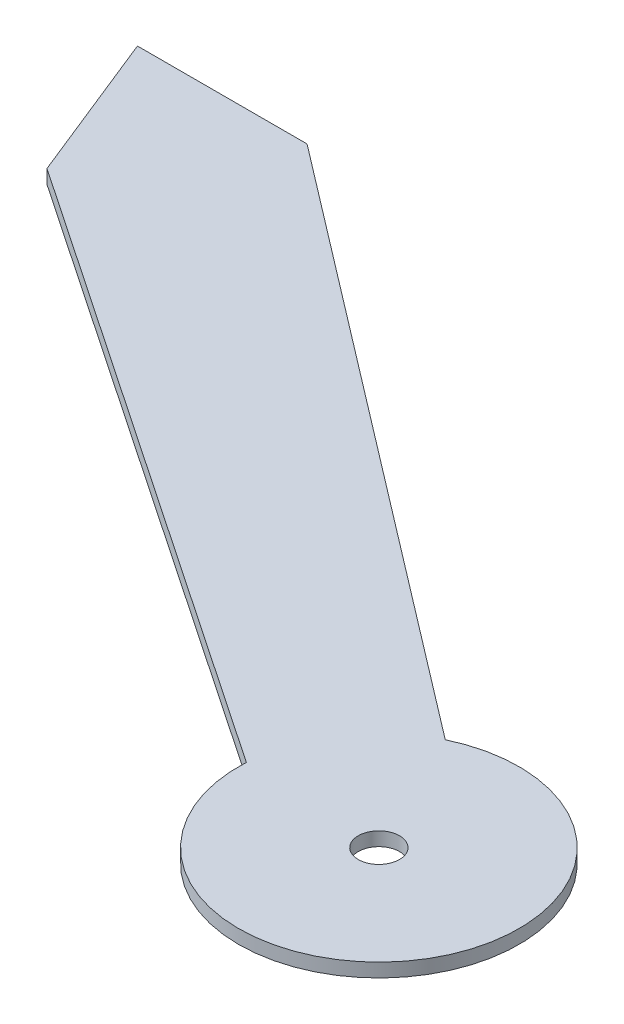
ISO-10303-21;
HEADER;
FILE_DESCRIPTION(('STEP AP214'),'2;1');
FILE_NAME('part.step','',(''),(''),'','','');
FILE_SCHEMA(('AUTOMOTIVE_DESIGN { 1 0 10303 214 1 1 1 1 }'));
ENDSEC;
DATA;
#1=APPLICATION_CONTEXT('core data for automotive mechanical design processes');
#2=APPLICATION_PROTOCOL_DEFINITION('international standard','automotive_design',2000,#1);
#3=PRODUCT_CONTEXT('',#1,'mechanical');
#4=PRODUCT('Part','Part','',(#3));
#5=PRODUCT_RELATED_PRODUCT_CATEGORY('part','',(#4));
#6=PRODUCT_DEFINITION_FORMATION('','',#4);
#7=PRODUCT_DEFINITION_CONTEXT('part definition',#1,'design');
#8=PRODUCT_DEFINITION('design','',#6,#7);
#9=PRODUCT_DEFINITION_SHAPE('','',#8);
#10=(LENGTH_UNIT() NAMED_UNIT(*) SI_UNIT(.MILLI.,.METRE.));
#11=(NAMED_UNIT(*) PLANE_ANGLE_UNIT() SI_UNIT($,.RADIAN.));
#12=(NAMED_UNIT(*) SI_UNIT($,.STERADIAN.) SOLID_ANGLE_UNIT());
#13=UNCERTAINTY_MEASURE_WITH_UNIT(LENGTH_MEASURE(1.E-05),#10,'distance_accuracy_value','');
#14=(GEOMETRIC_REPRESENTATION_CONTEXT(3) GLOBAL_UNCERTAINTY_ASSIGNED_CONTEXT((#13)) GLOBAL_UNIT_ASSIGNED_CONTEXT((#10,
#11,#12)) REPRESENTATION_CONTEXT('',''));
#15=CARTESIAN_POINT('',(0.,0.,0.));
#16=DIRECTION('',(0.,0.,1.));
#17=DIRECTION('',(1.,0.,0.));
#18=AXIS2_PLACEMENT_3D('',#15,#16,#17);
#19=CARTESIAN_POINT('',(0.,0.1,0.));
#20=DIRECTION('',(0.,1.,0.));
#21=DIRECTION('',(0.,0.,1.));
#22=AXIS2_PLACEMENT_3D('',#19,#20,#21);
#23=PLANE('',#22);
#24=CARTESIAN_POINT('',(0.,0.1,0.));
#25=DIRECTION('',(0.,1.,0.));
#26=DIRECTION('',(0.,0.,1.));
#27=AXIS2_PLACEMENT_3D('',#24,#25,#26);
#28=CIRCLE('',#27,0.15);
#29=CARTESIAN_POINT('',(0.,0.1,0.15));
#30=VERTEX_POINT('',#29);
#31=EDGE_CURVE('E173',#30,#30,#28,.T.);
#32=ORIENTED_EDGE('',*,*,#31,.F.);
#33=EDGE_LOOP('',(#32));
#34=FACE_BOUND('',#33,.T.);
#35=DIRECTION('',(-1.,0.,0.));
#36=VECTOR('',#35,1.);
#37=CARTESIAN_POINT('',(-5.9289769168446,0.1,-4.17249718028951));
#38=LINE('',#37,#36);
#39=CARTESIAN_POINT('',(-4.69495993819779,0.1,-4.17249718028951));
#40=VERTEX_POINT('',#39);
#41=CARTESIAN_POINT('',(-5.9289769168446,0.1,-4.17249718028951));
#42=VERTEX_POINT('',#41);
#43=EDGE_CURVE('E179',#40,#42,#38,.T.);
#44=ORIENTED_EDGE('',*,*,#43,.T.);
#45=DIRECTION('',(0.373094221766206,0.,0.927793458526556));
#46=VECTOR('',#45,1.);
#47=CARTESIAN_POINT('',(-5.9289769168446,0.1,-4.17249718028951));
#48=LINE('',#47,#46);
#49=CARTESIAN_POINT('',(-5.48619744070105,0.1,-3.07141365347674));
#50=VERTEX_POINT('',#49);
#51=EDGE_CURVE('E182',#42,#50,#48,.T.);
#52=ORIENTED_EDGE('',*,*,#51,.T.);
#53=DIRECTION('',(0.828755983601019,0.,0.559610149698437));
#54=VECTOR('',#53,1.);
#55=CARTESIAN_POINT('',(-5.48619744070105,0.1,-3.07141365347674));
#56=LINE('',#55,#54);
#57=CARTESIAN_POINT('',(-1.01900962634494,0.1,-0.0549845826896569));
#58=VERTEX_POINT('',#57);
#59=EDGE_CURVE('E185',#50,#58,#56,.T.);
#60=ORIENTED_EDGE('',*,*,#59,.T.);
#61=CARTESIAN_POINT('',(0.,0.1,0.));
#62=DIRECTION('',(0.,1.,0.));
#63=DIRECTION('',(0.,0.,1.));
#64=AXIS2_PLACEMENT_3D('',#61,#62,#63);
#65=CIRCLE('',#64,1.02049200041804);
#66=CARTESIAN_POINT('',(-0.438539423298249,0.1,-0.921459221631891));
#67=VERTEX_POINT('',#66);
#68=EDGE_CURVE('E188',#58,#67,#65,.T.);
#69=ORIENTED_EDGE('',*,*,#68,.T.);
#70=DIRECTION('',(-0.794706526696324,0.,-0.606993852049809));
#71=VECTOR('',#70,1.);
#72=CARTESIAN_POINT('',(-4.69495993819779,0.1,-4.17249718028951));
#73=LINE('',#72,#71);
#74=EDGE_CURVE('E190',#67,#40,#73,.T.);
#75=ORIENTED_EDGE('',*,*,#74,.T.);
#76=EDGE_LOOP('',(#44,#52,#60,#69,#75));
#77=FACE_BOUND('',#76,.T.);
#78=ADVANCED_FACE('F39',(#34,#77),#23,.T.);
#79=CARTESIAN_POINT('',(0.,0.,0.));
#80=DIRECTION('',(0.,1.,0.));
#81=DIRECTION('',(0.,0.,1.));
#82=AXIS2_PLACEMENT_3D('',#79,#80,#81);
#83=PLANE('',#82);
#84=CARTESIAN_POINT('',(0.,0.,0.));
#85=DIRECTION('',(0.,1.,0.));
#86=DIRECTION('',(0.,0.,1.));
#87=AXIS2_PLACEMENT_3D('',#84,#85,#86);
#88=CIRCLE('',#87,0.15);
#89=CARTESIAN_POINT('',(0.,0.,0.15));
#90=VERTEX_POINT('',#89);
#91=EDGE_CURVE('E172',#90,#90,#88,.T.);
#92=ORIENTED_EDGE('',*,*,#91,.T.);
#93=EDGE_LOOP('',(#92));
#94=FACE_BOUND('',#93,.T.);
#95=DIRECTION('',(-1.,0.,0.));
#96=VECTOR('',#95,1.);
#97=CARTESIAN_POINT('',(-5.9289769168446,0.,-4.17249718028951));
#98=LINE('',#97,#96);
#99=CARTESIAN_POINT('',(-4.69495993819779,0.,-4.17249718028951));
#100=VERTEX_POINT('',#99);
#101=CARTESIAN_POINT('',(-5.9289769168446,0.,-4.17249718028951));
#102=VERTEX_POINT('',#101);
#103=EDGE_CURVE('E176',#100,#102,#98,.T.);
#104=ORIENTED_EDGE('',*,*,#103,.F.);
#105=DIRECTION('',(-0.794706526696324,0.,-0.606993852049809));
#106=VECTOR('',#105,1.);
#107=CARTESIAN_POINT('',(-4.69495993819779,0.,-4.17249718028951));
#108=LINE('',#107,#106);
#109=CARTESIAN_POINT('',(-0.438539423298249,0.,-0.921459221631891));
#110=VERTEX_POINT('',#109);
#111=EDGE_CURVE('E183',#110,#100,#108,.T.);
#112=ORIENTED_EDGE('',*,*,#111,.F.);
#113=CARTESIAN_POINT('',(0.,0.,0.));
#114=DIRECTION('',(0.,1.,0.));
#115=DIRECTION('',(0.,0.,1.));
#116=AXIS2_PLACEMENT_3D('',#113,#114,#115);
#117=CIRCLE('',#116,1.02049200041804);
#118=CARTESIAN_POINT('',(-1.01900962634494,0.,-0.0549845826896569));
#119=VERTEX_POINT('',#118);
#120=EDGE_CURVE('E201',#119,#110,#117,.T.);
#121=ORIENTED_EDGE('',*,*,#120,.F.);
#122=DIRECTION('',(0.828755983601019,0.,0.559610149698437));
#123=VECTOR('',#122,1.);
#124=CARTESIAN_POINT('',(-5.48619744070105,0.,-3.07141365347674));
#125=LINE('',#124,#123);
#126=CARTESIAN_POINT('',(-5.48619744070105,0.,-3.07141365347674));
#127=VERTEX_POINT('',#126);
#128=EDGE_CURVE('E198',#127,#119,#125,.T.);
#129=ORIENTED_EDGE('',*,*,#128,.F.);
#130=DIRECTION('',(0.373094221766206,0.,0.927793458526556));
#131=VECTOR('',#130,1.);
#132=CARTESIAN_POINT('',(-5.9289769168446,0.,-4.17249718028951));
#133=LINE('',#132,#131);
#134=EDGE_CURVE('E196',#102,#127,#133,.T.);
#135=ORIENTED_EDGE('',*,*,#134,.F.);
#136=EDGE_LOOP('',(#104,#112,#121,#129,#135));
#137=FACE_BOUND('',#136,.T.);
#138=DIRECTION('',(-1.,0.,0.));
#139=VECTOR('',#138,1.);
#140=CARTESIAN_POINT('',(-4.89099325745752,0.,-3.86089264183193));
#141=LINE('',#140,#139);
#142=CARTESIAN_POINT('',(-4.89099325745752,0.,-3.86089264183193));
#143=VERTEX_POINT('',#142);
#144=CARTESIAN_POINT('',(-5.48619744070105,0.,-3.86089264183193));
#145=VERTEX_POINT('',#144);
#146=EDGE_CURVE('E144',#143,#145,#141,.T.);
#147=ORIENTED_EDGE('',*,*,#146,.T.);
#148=DIRECTION('',(0.415635410517343,0.,0.90953131090913));
#149=VECTOR('',#148,1.);
#150=CARTESIAN_POINT('',(-5.48619744070105,0.,-3.86089264183193));
#151=LINE('',#150,#149);
#152=CARTESIAN_POINT('',(-5.21685624870859,0.,-3.271495681814));
#153=VERTEX_POINT('',#152);
#154=EDGE_CURVE('E147',#145,#153,#151,.T.);
#155=ORIENTED_EDGE('',*,*,#154,.T.);
#156=DIRECTION('',(0.829436927105277,0.,0.558600379479064));
#157=VECTOR('',#156,1.);
#158=CARTESIAN_POINT('',(-5.21685624870859,0.,-3.271495681814));
#159=LINE('',#158,#157);
#160=CARTESIAN_POINT('',(-2.20023489839308,0.,-1.23989354792803));
#161=VERTEX_POINT('',#160);
#162=EDGE_CURVE('E155',#153,#161,#159,.T.);
#163=ORIENTED_EDGE('',*,*,#162,.T.);
#164=DIRECTION('',(0.558600379479064,0.,-0.829436927105277));
#165=VECTOR('',#164,1.);
#166=CARTESIAN_POINT('',(-2.20023489839308,0.,-1.23989354792803));
#167=LINE('',#166,#165);
#168=CARTESIAN_POINT('',(-1.9486131154784,0.,-1.61351377104376));
#169=VERTEX_POINT('',#168);
#170=EDGE_CURVE('E159',#161,#169,#167,.T.);
#171=ORIENTED_EDGE('',*,*,#170,.T.);
#172=DIRECTION('',(-0.794706526696323,0.,-0.606993852049809));
#173=VECTOR('',#172,1.);
#174=CARTESIAN_POINT('',(-1.9486131154784,0.,-1.61351377104376));
#175=LINE('',#174,#173);
#176=EDGE_CURVE('E126',#169,#143,#175,.T.);
#177=ORIENTED_EDGE('',*,*,#176,.T.);
#178=EDGE_LOOP('',(#147,#155,#163,#171,#177));
#179=FACE_BOUND('',#178,.T.);
#180=ADVANCED_FACE('F226',(#94,#137,#179),#83,.F.);
#181=CARTESIAN_POINT('',(-5.9289769168446,0.1,-4.17249718028951));
#182=DIRECTION('',(0.,0.,1.));
#183=DIRECTION('',(1.,0.,0.));
#184=AXIS2_PLACEMENT_3D('',#181,#182,#183);
#185=PLANE('',#184);
#186=ORIENTED_EDGE('',*,*,#103,.T.);
#187=DIRECTION('',(0.,-1.,0.));
#188=VECTOR('',#187,1.);
#189=CARTESIAN_POINT('',(-5.9289769168446,0.1,-4.17249718028951));
#190=LINE('',#189,#188);
#191=EDGE_CURVE('E48',#42,#102,#190,.T.);
#192=ORIENTED_EDGE('',*,*,#191,.F.);
#193=ORIENTED_EDGE('',*,*,#43,.F.);
#194=DIRECTION('',(0.,-1.,0.));
#195=VECTOR('',#194,1.);
#196=CARTESIAN_POINT('',(-4.69495993819779,0.1,-4.17249718028951));
#197=LINE('',#196,#195);
#198=EDGE_CURVE('E193',#40,#100,#197,.T.);
#199=ORIENTED_EDGE('',*,*,#198,.T.);
#200=EDGE_LOOP('',(#186,#192,#193,#199));
#201=FACE_BOUND('',#200,.T.);
#202=ADVANCED_FACE('F41',(#201),#185,.F.);
#203=CARTESIAN_POINT('',(-5.9289769168446,0.1,-4.17249718028951));
#204=DIRECTION('',(0.927793458526556,0.,-0.373094221766206));
#205=DIRECTION('',(-0.373094221766206,0.,-0.927793458526556));
#206=AXIS2_PLACEMENT_3D('',#203,#204,#205);
#207=PLANE('',#206);
#208=ORIENTED_EDGE('',*,*,#134,.T.);
#209=DIRECTION('',(0.,-1.,0.));
#210=VECTOR('',#209,1.);
#211=CARTESIAN_POINT('',(-5.48619744070105,0.1,-3.07141365347674));
#212=LINE('',#211,#210);
#213=EDGE_CURVE('E213',#50,#127,#212,.T.);
#214=ORIENTED_EDGE('',*,*,#213,.F.);
#215=ORIENTED_EDGE('',*,*,#51,.F.);
#216=ORIENTED_EDGE('',*,*,#191,.T.);
#217=EDGE_LOOP('',(#208,#214,#215,#216));
#218=FACE_BOUND('',#217,.T.);
#219=ADVANCED_FACE('F218',(#218),#207,.F.);
#220=CARTESIAN_POINT('',(-5.48619744070105,0.1,-3.07141365347674));
#221=DIRECTION('',(0.559610149698437,0.,-0.828755983601019));
#222=DIRECTION('',(-0.828755983601019,0.,-0.559610149698437));
#223=AXIS2_PLACEMENT_3D('',#220,#221,#222);
#224=PLANE('',#223);
#225=ORIENTED_EDGE('',*,*,#128,.T.);
#226=DIRECTION('',(0.,-1.,0.));
#227=VECTOR('',#226,1.);
#228=CARTESIAN_POINT('',(-1.01900962634494,0.1,-0.0549845826896569));
#229=LINE('',#228,#227);
#230=EDGE_CURVE('E210',#58,#119,#229,.T.);
#231=ORIENTED_EDGE('',*,*,#230,.F.);
#232=ORIENTED_EDGE('',*,*,#59,.F.);
#233=ORIENTED_EDGE('',*,*,#213,.T.);
#234=EDGE_LOOP('',(#225,#231,#232,#233));
#235=FACE_BOUND('',#234,.T.);
#236=ADVANCED_FACE('F232',(#235),#224,.F.);
#237=CARTESIAN_POINT('',(0.,0.1,0.));
#238=DIRECTION('',(0.,-1.,0.));
#239=DIRECTION('',(0.,0.,-1.));
#240=AXIS2_PLACEMENT_3D('',#237,#238,#239);
#241=CYLINDRICAL_SURFACE('',#240,1.02049200041804);
#242=ORIENTED_EDGE('',*,*,#120,.T.);
#243=DIRECTION('',(0.,-1.,0.));
#244=VECTOR('',#243,1.);
#245=CARTESIAN_POINT('',(-0.438539423298249,0.1,-0.921459221631891));
#246=LINE('',#245,#244);
#247=EDGE_CURVE('E207',#67,#110,#246,.T.);
#248=ORIENTED_EDGE('',*,*,#247,.F.);
#249=ORIENTED_EDGE('',*,*,#68,.F.);
#250=ORIENTED_EDGE('',*,*,#230,.T.);
#251=EDGE_LOOP('',(#242,#248,#249,#250));
#252=FACE_BOUND('',#251,.T.);
#253=ADVANCED_FACE('F236',(#252),#241,.T.);
#254=CARTESIAN_POINT('',(-4.69495993819779,0.1,-4.17249718028951));
#255=DIRECTION('',(-0.606993852049809,0.,0.794706526696324));
#256=DIRECTION('',(0.794706526696324,0.,0.606993852049809));
#257=AXIS2_PLACEMENT_3D('',#254,#255,#256);
#258=PLANE('',#257);
#259=ORIENTED_EDGE('',*,*,#111,.T.);
#260=ORIENTED_EDGE('',*,*,#198,.F.);
#261=ORIENTED_EDGE('',*,*,#74,.F.);
#262=ORIENTED_EDGE('',*,*,#247,.T.);
#263=EDGE_LOOP('',(#259,#260,#261,#262));
#264=FACE_BOUND('',#263,.T.);
#265=ADVANCED_FACE('F241',(#264),#258,.F.);
#266=CARTESIAN_POINT('',(0.,0.1,0.));
#267=DIRECTION('',(0.,-1.,0.));
#268=DIRECTION('',(0.,0.,-1.));
#269=AXIS2_PLACEMENT_3D('',#266,#267,#268);
#270=CYLINDRICAL_SURFACE('',#269,0.15);
#271=ORIENTED_EDGE('',*,*,#31,.T.);
#272=EDGE_LOOP('',(#271));
#273=FACE_BOUND('',#272,.T.);
#274=ORIENTED_EDGE('',*,*,#91,.F.);
#275=EDGE_LOOP('',(#274));
#276=FACE_BOUND('',#275,.T.);
#277=ADVANCED_FACE('F243',(#273,#276),#270,.F.);
#278=CARTESIAN_POINT('',(-4.89099325745752,0.1,-3.86089264183193));
#279=DIRECTION('',(0.,0.,1.));
#280=DIRECTION('',(1.,0.,0.));
#281=AXIS2_PLACEMENT_3D('',#278,#279,#280);
#282=PLANE('',#281);
#283=DIRECTION('',(1.,0.,0.));
#284=VECTOR('',#283,1.);
#285=CARTESIAN_POINT('',(-4.89099325745752,0.08,-3.86089264183193));
#286=LINE('',#285,#284);
#287=CARTESIAN_POINT('',(-5.48619744070105,0.08,-3.86089264183193));
#288=VERTEX_POINT('',#287);
#289=CARTESIAN_POINT('',(-4.89099325745752,0.08,-3.86089264183193));
#290=VERTEX_POINT('',#289);
#291=EDGE_CURVE('E55',#288,#290,#286,.T.);
#292=ORIENTED_EDGE('',*,*,#291,.F.);
#293=DIRECTION('',(0.,-1.,0.));
#294=VECTOR('',#293,1.);
#295=CARTESIAN_POINT('',(-5.48619744070105,0.1,-3.86089264183193));
#296=LINE('',#295,#294);
#297=EDGE_CURVE('E170',#288,#145,#296,.T.);
#298=ORIENTED_EDGE('',*,*,#297,.T.);
#299=ORIENTED_EDGE('',*,*,#146,.F.);
#300=DIRECTION('',(0.,-1.,0.));
#301=VECTOR('',#300,1.);
#302=CARTESIAN_POINT('',(-4.89099325745752,0.1,-3.86089264183193));
#303=LINE('',#302,#301);
#304=EDGE_CURVE('E132',#290,#143,#303,.T.);
#305=ORIENTED_EDGE('',*,*,#304,.F.);
#306=EDGE_LOOP('',(#292,#298,#299,#305));
#307=FACE_BOUND('',#306,.T.);
#308=ADVANCED_FACE('F249',(#307),#282,.T.);
#309=CARTESIAN_POINT('',(-5.48619744070105,0.1,-3.86089264183193));
#310=DIRECTION('',(0.90953131090913,0.,-0.415635410517343));
#311=DIRECTION('',(-0.415635410517343,0.,-0.90953131090913));
#312=AXIS2_PLACEMENT_3D('',#309,#310,#311);
#313=PLANE('',#312);
#314=DIRECTION('',(-0.415635410517343,0.,-0.90953131090913));
#315=VECTOR('',#314,1.);
#316=CARTESIAN_POINT('',(-5.48619744070105,0.08,-3.86089264183193));
#317=LINE('',#316,#315);
#318=CARTESIAN_POINT('',(-5.21685624870859,0.08,-3.271495681814));
#319=VERTEX_POINT('',#318);
#320=EDGE_CURVE('E62',#319,#288,#317,.T.);
#321=ORIENTED_EDGE('',*,*,#320,.F.);
#322=DIRECTION('',(0.,-1.,0.));
#323=VECTOR('',#322,1.);
#324=CARTESIAN_POINT('',(-5.21685624870859,0.1,-3.271495681814));
#325=LINE('',#324,#323);
#326=EDGE_CURVE('E167',#319,#153,#325,.T.);
#327=ORIENTED_EDGE('',*,*,#326,.T.);
#328=ORIENTED_EDGE('',*,*,#154,.F.);
#329=ORIENTED_EDGE('',*,*,#297,.F.);
#330=EDGE_LOOP('',(#321,#327,#328,#329));
#331=FACE_BOUND('',#330,.T.);
#332=ADVANCED_FACE('F265',(#331),#313,.T.);
#333=CARTESIAN_POINT('',(-5.21685624870859,0.1,-3.271495681814));
#334=DIRECTION('',(0.558600379479064,0.,-0.829436927105277));
#335=DIRECTION('',(-0.829436927105278,0.,-0.558600379479064));
#336=AXIS2_PLACEMENT_3D('',#333,#334,#335);
#337=PLANE('',#336);
#338=DIRECTION('',(-0.829436927105278,0.,-0.558600379479064));
#339=VECTOR('',#338,1.);
#340=CARTESIAN_POINT('',(-5.21685624870859,0.08,-3.271495681814));
#341=LINE('',#340,#339);
#342=CARTESIAN_POINT('',(-2.20023489839308,0.08,-1.23989354792803));
#343=VERTEX_POINT('',#342);
#344=EDGE_CURVE('E141',#343,#319,#341,.T.);
#345=ORIENTED_EDGE('',*,*,#344,.F.);
#346=DIRECTION('',(0.,-1.,0.));
#347=VECTOR('',#346,1.);
#348=CARTESIAN_POINT('',(-2.20023489839308,0.1,-1.23989354792803));
#349=LINE('',#348,#347);
#350=EDGE_CURVE('E131',#343,#161,#349,.T.);
#351=ORIENTED_EDGE('',*,*,#350,.T.);
#352=ORIENTED_EDGE('',*,*,#162,.F.);
#353=ORIENTED_EDGE('',*,*,#326,.F.);
#354=EDGE_LOOP('',(#345,#351,#352,#353));
#355=FACE_BOUND('',#354,.T.);
#356=ADVANCED_FACE('F268',(#355),#337,.T.);
#357=CARTESIAN_POINT('',(-2.20023489839308,0.1,-1.23989354792803));
#358=DIRECTION('',(-0.829436927105277,0.,-0.558600379479064));
#359=DIRECTION('',(-0.558600379479064,0.,0.829436927105277));
#360=AXIS2_PLACEMENT_3D('',#357,#358,#359);
#361=PLANE('',#360);
#362=DIRECTION('',(-0.558600379479064,0.,0.829436927105277));
#363=VECTOR('',#362,1.);
#364=CARTESIAN_POINT('',(-2.20023489839308,0.08,-1.23989354792803));
#365=LINE('',#364,#363);
#366=CARTESIAN_POINT('',(-1.9486131154784,0.08,-1.61351377104376));
#367=VERTEX_POINT('',#366);
#368=EDGE_CURVE('E136',#367,#343,#365,.T.);
#369=ORIENTED_EDGE('',*,*,#368,.F.);
#370=DIRECTION('',(0.,-1.,0.));
#371=VECTOR('',#370,1.);
#372=CARTESIAN_POINT('',(-1.9486131154784,0.1,-1.61351377104376));
#373=LINE('',#372,#371);
#374=EDGE_CURVE('E122',#367,#169,#373,.T.);
#375=ORIENTED_EDGE('',*,*,#374,.T.);
#376=ORIENTED_EDGE('',*,*,#170,.F.);
#377=ORIENTED_EDGE('',*,*,#350,.F.);
#378=EDGE_LOOP('',(#369,#375,#376,#377));
#379=FACE_BOUND('',#378,.T.);
#380=ADVANCED_FACE('F137',(#379),#361,.T.);
#381=CARTESIAN_POINT('',(-1.9486131154784,0.1,-1.61351377104376));
#382=DIRECTION('',(-0.606993852049809,0.,0.794706526696323));
#383=DIRECTION('',(0.794706526696324,0.,0.606993852049809));
#384=AXIS2_PLACEMENT_3D('',#381,#382,#383);
#385=PLANE('',#384);
#386=DIRECTION('',(0.794706526696324,0.,0.606993852049809));
#387=VECTOR('',#386,1.);
#388=CARTESIAN_POINT('',(-1.9486131154784,0.08,-1.61351377104376));
#389=LINE('',#388,#387);
#390=EDGE_CURVE('E11',#290,#367,#389,.T.);
#391=ORIENTED_EDGE('',*,*,#390,.F.);
#392=ORIENTED_EDGE('',*,*,#304,.T.);
#393=ORIENTED_EDGE('',*,*,#176,.F.);
#394=ORIENTED_EDGE('',*,*,#374,.F.);
#395=EDGE_LOOP('',(#391,#392,#393,#394));
#396=FACE_BOUND('',#395,.T.);
#397=ADVANCED_FACE('F124',(#396),#385,.T.);
#398=CARTESIAN_POINT('',(0.,0.08,0.));
#399=DIRECTION('',(0.,-1.,0.));
#400=DIRECTION('',(0.,0.,-1.));
#401=AXIS2_PLACEMENT_3D('',#398,#399,#400);
#402=PLANE('',#401);
#403=ORIENTED_EDGE('',*,*,#320,.T.);
#404=ORIENTED_EDGE('',*,*,#291,.T.);
#405=ORIENTED_EDGE('',*,*,#390,.T.);
#406=ORIENTED_EDGE('',*,*,#368,.T.);
#407=ORIENTED_EDGE('',*,*,#344,.T.);
#408=EDGE_LOOP('',(#403,#404,#405,#406,#407));
#409=FACE_BOUND('',#408,.T.);
#410=ADVANCED_FACE('F143',(#409),#402,.T.);
#411=CLOSED_SHELL('',(#78,#180,#202,#219,#236,#253,#265,#277,#308,#332,#356,#380,#397,#410));
#412=MANIFOLD_SOLID_BREP('B2',#411);
#413=ADVANCED_BREP_SHAPE_REPRESENTATION('',(#18,#412),#14);
#414=SHAPE_DEFINITION_REPRESENTATION(#9,#413);
ENDSEC;
END-ISO-10303-21;
